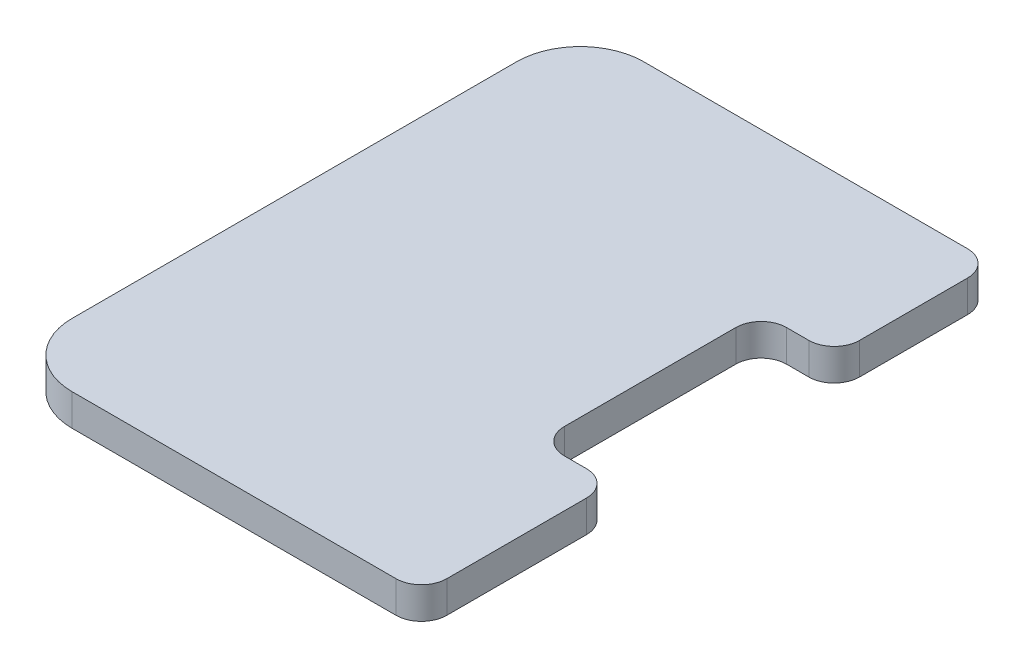
ISO-10303-21;
HEADER;
FILE_DESCRIPTION(('STEP AP214'),'2;1');
FILE_NAME('part.step','',(''),(''),'','','');
FILE_SCHEMA(('AUTOMOTIVE_DESIGN { 1 0 10303 214 1 1 1 1 }'));
ENDSEC;
DATA;
#1=APPLICATION_CONTEXT('core data for automotive mechanical design processes');
#2=APPLICATION_PROTOCOL_DEFINITION('international standard','automotive_design',2000,#1);
#3=PRODUCT_CONTEXT('',#1,'mechanical');
#4=PRODUCT('Part','Part','',(#3));
#5=PRODUCT_RELATED_PRODUCT_CATEGORY('part','',(#4));
#6=PRODUCT_DEFINITION_FORMATION('','',#4);
#7=PRODUCT_DEFINITION_CONTEXT('part definition',#1,'design');
#8=PRODUCT_DEFINITION('design','',#6,#7);
#9=PRODUCT_DEFINITION_SHAPE('','',#8);
#10=(LENGTH_UNIT() NAMED_UNIT(*) SI_UNIT(.MILLI.,.METRE.));
#11=(NAMED_UNIT(*) PLANE_ANGLE_UNIT() SI_UNIT($,.RADIAN.));
#12=(NAMED_UNIT(*) SI_UNIT($,.STERADIAN.) SOLID_ANGLE_UNIT());
#13=UNCERTAINTY_MEASURE_WITH_UNIT(LENGTH_MEASURE(1.E-05),#10,'distance_accuracy_value','');
#14=(GEOMETRIC_REPRESENTATION_CONTEXT(3) GLOBAL_UNCERTAINTY_ASSIGNED_CONTEXT((#13)) GLOBAL_UNIT_ASSIGNED_CONTEXT((#10,
#11,#12)) REPRESENTATION_CONTEXT('',''));
#15=CARTESIAN_POINT('',(0.,0.,0.));
#16=DIRECTION('',(0.,0.,1.));
#17=DIRECTION('',(1.,0.,0.));
#18=AXIS2_PLACEMENT_3D('',#15,#16,#17);
#19=CARTESIAN_POINT('',(20.6375,3.175,28.575));
#20=DIRECTION('',(-1.,0.,0.));
#21=DIRECTION('',(0.,0.,1.));
#22=AXIS2_PLACEMENT_3D('',#19,#20,#21);
#23=PLANE('',#22);
#24=DIRECTION('',(0.,0.,-1.));
#25=VECTOR('',#24,1.);
#26=CARTESIAN_POINT('',(20.6375,3.175,28.575));
#27=LINE('',#26,#25);
#28=CARTESIAN_POINT('',(20.6375,3.175,26.035));
#29=VERTEX_POINT('',#28);
#30=CARTESIAN_POINT('',(20.6375,3.175,12.065));
#31=VERTEX_POINT('',#30);
#32=EDGE_CURVE('E214',#29,#31,#27,.T.);
#33=ORIENTED_EDGE('',*,*,#32,.F.);
#34=DIRECTION('',(0.,-1.,0.));
#35=VECTOR('',#34,1.);
#36=CARTESIAN_POINT('',(20.6375,3.175,26.035));
#37=LINE('',#36,#35);
#38=CARTESIAN_POINT('',(20.6375,0.,26.035));
#39=VERTEX_POINT('',#38);
#40=EDGE_CURVE('E198',#29,#39,#37,.T.);
#41=ORIENTED_EDGE('',*,*,#40,.T.);
#42=DIRECTION('',(0.,0.,-1.));
#43=VECTOR('',#42,1.);
#44=CARTESIAN_POINT('',(20.6375,0.,28.575));
#45=LINE('',#44,#43);
#46=CARTESIAN_POINT('',(20.6375,0.,12.065));
#47=VERTEX_POINT('',#46);
#48=EDGE_CURVE('E211',#39,#47,#45,.T.);
#49=ORIENTED_EDGE('',*,*,#48,.T.);
#50=DIRECTION('',(0.,1.,0.));
#51=VECTOR('',#50,1.);
#52=CARTESIAN_POINT('',(20.6375,3.175,12.065));
#53=LINE('',#52,#51);
#54=EDGE_CURVE('E217',#47,#31,#53,.T.);
#55=ORIENTED_EDGE('',*,*,#54,.T.);
#56=EDGE_LOOP('',(#33,#41,#49,#55));
#57=FACE_BOUND('',#56,.T.);
#58=ADVANCED_FACE('F45',(#57),#23,.F.);
#59=CARTESIAN_POINT('',(20.6375,0.,-15.24));
#60=VERTEX_POINT('',#59);
#61=CARTESIAN_POINT('',(20.6375,0.,-26.035));
#62=VERTEX_POINT('',#61);
#63=EDGE_CURVE('E225',#60,#62,#45,.T.);
#64=ORIENTED_EDGE('',*,*,#63,.T.);
#65=DIRECTION('',(0.,-1.,0.));
#66=VECTOR('',#65,1.);
#67=CARTESIAN_POINT('',(20.6375,3.175,-26.035));
#68=LINE('',#67,#66);
#69=CARTESIAN_POINT('',(20.6375,3.175,-26.035));
#70=VERTEX_POINT('',#69);
#71=EDGE_CURVE('E273',#62,#70,#68,.F.);
#72=ORIENTED_EDGE('',*,*,#71,.T.);
#73=CARTESIAN_POINT('',(20.6375,3.175,-15.24));
#74=VERTEX_POINT('',#73);
#75=EDGE_CURVE('E243',#74,#70,#27,.T.);
#76=ORIENTED_EDGE('',*,*,#75,.F.);
#77=DIRECTION('',(0.,1.,0.));
#78=VECTOR('',#77,1.);
#79=CARTESIAN_POINT('',(20.6375,3.175,-15.24));
#80=LINE('',#79,#78);
#81=EDGE_CURVE('E270',#74,#60,#80,.F.);
#82=ORIENTED_EDGE('',*,*,#81,.T.);
#83=EDGE_LOOP('',(#64,#72,#76,#82));
#84=FACE_BOUND('',#83,.T.);
#85=ADVANCED_FACE('F355',(#84),#23,.F.);
#86=CARTESIAN_POINT('',(-20.6375,3.175,-28.575));
#87=DIRECTION('',(0.,0.,1.));
#88=DIRECTION('',(1.,0.,0.));
#89=AXIS2_PLACEMENT_3D('',#86,#87,#88);
#90=PLANE('',#89);
#91=DIRECTION('',(-1.,0.,0.));
#92=VECTOR('',#91,1.);
#93=CARTESIAN_POINT('',(-20.6375,0.,-28.575));
#94=LINE('',#93,#92);
#95=CARTESIAN_POINT('',(18.0975,0.,-28.575));
#96=VERTEX_POINT('',#95);
#97=CARTESIAN_POINT('',(-14.2875,0.,-28.575));
#98=VERTEX_POINT('',#97);
#99=EDGE_CURVE('E224',#96,#98,#94,.T.);
#100=ORIENTED_EDGE('',*,*,#99,.T.);
#101=DIRECTION('',(0.,-1.,0.));
#102=VECTOR('',#101,1.);
#103=CARTESIAN_POINT('',(-14.2875,3.175,-28.575));
#104=LINE('',#103,#102);
#105=CARTESIAN_POINT('',(-14.2875,3.175,-28.575));
#106=VERTEX_POINT('',#105);
#107=EDGE_CURVE('E11',#98,#106,#104,.F.);
#108=ORIENTED_EDGE('',*,*,#107,.T.);
#109=DIRECTION('',(-1.,0.,0.));
#110=VECTOR('',#109,1.);
#111=CARTESIAN_POINT('',(-20.6375,3.175,-28.575));
#112=LINE('',#111,#110);
#113=CARTESIAN_POINT('',(18.0975,3.175,-28.575));
#114=VERTEX_POINT('',#113);
#115=EDGE_CURVE('E347',#114,#106,#112,.T.);
#116=ORIENTED_EDGE('',*,*,#115,.F.);
#117=DIRECTION('',(0.,-1.,0.));
#118=VECTOR('',#117,1.);
#119=CARTESIAN_POINT('',(18.0975,3.175,-28.575));
#120=LINE('',#119,#118);
#121=EDGE_CURVE('E266',#114,#96,#120,.T.);
#122=ORIENTED_EDGE('',*,*,#121,.T.);
#123=EDGE_LOOP('',(#100,#108,#116,#122));
#124=FACE_BOUND('',#123,.T.);
#125=ADVANCED_FACE('F345',(#124),#90,.F.);
#126=CARTESIAN_POINT('',(-20.6375,3.175,28.575));
#127=DIRECTION('',(1.,0.,0.));
#128=DIRECTION('',(0.,0.,-1.));
#129=AXIS2_PLACEMENT_3D('',#126,#127,#128);
#130=PLANE('',#129);
#131=DIRECTION('',(0.,0.,1.));
#132=VECTOR('',#131,1.);
#133=CARTESIAN_POINT('',(-20.6375,0.,28.575));
#134=LINE('',#133,#132);
#135=CARTESIAN_POINT('',(-20.6375,0.,-22.225));
#136=VERTEX_POINT('',#135);
#137=CARTESIAN_POINT('',(-20.6375,0.,22.225));
#138=VERTEX_POINT('',#137);
#139=EDGE_CURVE('E229',#136,#138,#134,.T.);
#140=ORIENTED_EDGE('',*,*,#139,.T.);
#141=DIRECTION('',(0.,-1.,0.));
#142=VECTOR('',#141,1.);
#143=CARTESIAN_POINT('',(-20.6375,3.175,22.225));
#144=LINE('',#143,#142);
#145=CARTESIAN_POINT('',(-20.6375,3.175,22.225));
#146=VERTEX_POINT('',#145);
#147=EDGE_CURVE('E72',#138,#146,#144,.F.);
#148=ORIENTED_EDGE('',*,*,#147,.T.);
#149=DIRECTION('',(0.,0.,1.));
#150=VECTOR('',#149,1.);
#151=CARTESIAN_POINT('',(-20.6375,3.175,28.575));
#152=LINE('',#151,#150);
#153=CARTESIAN_POINT('',(-20.6375,3.175,-22.225));
#154=VERTEX_POINT('',#153);
#155=EDGE_CURVE('E333',#154,#146,#152,.T.);
#156=ORIENTED_EDGE('',*,*,#155,.F.);
#157=DIRECTION('',(0.,-1.,0.));
#158=VECTOR('',#157,1.);
#159=CARTESIAN_POINT('',(-20.6375,3.175,-22.225));
#160=LINE('',#159,#158);
#161=EDGE_CURVE('E319',#154,#136,#160,.T.);
#162=ORIENTED_EDGE('',*,*,#161,.T.);
#163=EDGE_LOOP('',(#140,#148,#156,#162));
#164=FACE_BOUND('',#163,.T.);
#165=ADVANCED_FACE('F340',(#164),#130,.F.);
#166=CARTESIAN_POINT('',(-20.6375,3.175,28.575));
#167=DIRECTION('',(0.,0.,-1.));
#168=DIRECTION('',(-1.,0.,0.));
#169=AXIS2_PLACEMENT_3D('',#166,#167,#168);
#170=PLANE('',#169);
#171=DIRECTION('',(1.,0.,0.));
#172=VECTOR('',#171,1.);
#173=CARTESIAN_POINT('',(-20.6375,3.175,28.575));
#174=LINE('',#173,#172);
#175=CARTESIAN_POINT('',(-14.2875,3.175,28.575));
#176=VERTEX_POINT('',#175);
#177=CARTESIAN_POINT('',(18.0975,3.175,28.575));
#178=VERTEX_POINT('',#177);
#179=EDGE_CURVE('E235',#176,#178,#174,.T.);
#180=ORIENTED_EDGE('',*,*,#179,.F.);
#181=DIRECTION('',(0.,-1.,0.));
#182=VECTOR('',#181,1.);
#183=CARTESIAN_POINT('',(-14.2875,3.175,28.575));
#184=LINE('',#183,#182);
#185=CARTESIAN_POINT('',(-14.2875,0.,28.575));
#186=VERTEX_POINT('',#185);
#187=EDGE_CURVE('E309',#176,#186,#184,.T.);
#188=ORIENTED_EDGE('',*,*,#187,.T.);
#189=DIRECTION('',(1.,0.,0.));
#190=VECTOR('',#189,1.);
#191=CARTESIAN_POINT('',(-20.6375,0.,28.575));
#192=LINE('',#191,#190);
#193=CARTESIAN_POINT('',(18.0975,0.,28.575));
#194=VERTEX_POINT('',#193);
#195=EDGE_CURVE('E240',#186,#194,#192,.T.);
#196=ORIENTED_EDGE('',*,*,#195,.T.);
#197=DIRECTION('',(0.,-1.,0.));
#198=VECTOR('',#197,1.);
#199=CARTESIAN_POINT('',(18.0975,3.175,28.575));
#200=LINE('',#199,#198);
#201=EDGE_CURVE('E200',#194,#178,#200,.F.);
#202=ORIENTED_EDGE('',*,*,#201,.T.);
#203=EDGE_LOOP('',(#180,#188,#196,#202));
#204=FACE_BOUND('',#203,.T.);
#205=ADVANCED_FACE('F337',(#204),#170,.F.);
#206=CARTESIAN_POINT('',(0.,3.175,0.));
#207=DIRECTION('',(0.,-1.,0.));
#208=DIRECTION('',(0.,0.,-1.));
#209=AXIS2_PLACEMENT_3D('',#206,#207,#208);
#210=PLANE('',#209);
#211=ORIENTED_EDGE('',*,*,#155,.T.);
#212=CARTESIAN_POINT('',(-14.2875,3.175,22.225));
#213=DIRECTION('',(0.,-1.,0.));
#214=DIRECTION('',(0.,0.,-1.));
#215=AXIS2_PLACEMENT_3D('',#212,#213,#214);
#216=CIRCLE('',#215,6.35);
#217=EDGE_CURVE('E54',#146,#176,#216,.F.);
#218=ORIENTED_EDGE('',*,*,#217,.T.);
#219=ORIENTED_EDGE('',*,*,#179,.T.);
#220=CARTESIAN_POINT('',(18.0975,3.175,26.035));
#221=DIRECTION('',(0.,-1.,0.));
#222=DIRECTION('',(0.,0.,-1.));
#223=AXIS2_PLACEMENT_3D('',#220,#221,#222);
#224=CIRCLE('',#223,2.54);
#225=EDGE_CURVE('E263',#178,#29,#224,.F.);
#226=ORIENTED_EDGE('',*,*,#225,.T.);
#227=ORIENTED_EDGE('',*,*,#32,.T.);
#228=CARTESIAN_POINT('',(18.0975,3.175,12.065));
#229=DIRECTION('',(0.,-1.,0.));
#230=DIRECTION('',(0.,0.,-1.));
#231=AXIS2_PLACEMENT_3D('',#228,#229,#230);
#232=CIRCLE('',#231,2.54);
#233=CARTESIAN_POINT('',(18.0975,3.175,9.525));
#234=VERTEX_POINT('',#233);
#235=EDGE_CURVE('E257',#31,#234,#232,.F.);
#236=ORIENTED_EDGE('',*,*,#235,.T.);
#237=DIRECTION('',(1.,0.,0.));
#238=VECTOR('',#237,1.);
#239=CARTESIAN_POINT('',(20.6375,3.175,9.525));
#240=LINE('',#239,#238);
#241=CARTESIAN_POINT('',(15.875,3.175,9.525));
#242=VERTEX_POINT('',#241);
#243=EDGE_CURVE('E373',#242,#234,#240,.T.);
#244=ORIENTED_EDGE('',*,*,#243,.F.);
#245=CARTESIAN_POINT('',(15.875,3.175,6.985));
#246=DIRECTION('',(0.,-1.,0.));
#247=DIRECTION('',(0.,0.,-1.));
#248=AXIS2_PLACEMENT_3D('',#245,#246,#247);
#249=CIRCLE('',#248,2.54);
#250=CARTESIAN_POINT('',(13.335,3.175,6.985));
#251=VERTEX_POINT('',#250);
#252=EDGE_CURVE('E297',#242,#251,#249,.T.);
#253=ORIENTED_EDGE('',*,*,#252,.T.);
#254=DIRECTION('',(0.,0.,1.));
#255=VECTOR('',#254,1.);
#256=CARTESIAN_POINT('',(13.335,3.175,9.525));
#257=LINE('',#256,#255);
#258=CARTESIAN_POINT('',(13.335,3.175,-10.16));
#259=VERTEX_POINT('',#258);
#260=EDGE_CURVE('E380',#259,#251,#257,.T.);
#261=ORIENTED_EDGE('',*,*,#260,.F.);
#262=CARTESIAN_POINT('',(15.875,3.175,-10.16));
#263=DIRECTION('',(0.,-1.,0.));
#264=DIRECTION('',(0.,0.,-1.));
#265=AXIS2_PLACEMENT_3D('',#262,#263,#264);
#266=CIRCLE('',#265,2.54);
#267=CARTESIAN_POINT('',(15.875,3.175,-12.7));
#268=VERTEX_POINT('',#267);
#269=EDGE_CURVE('E303',#259,#268,#266,.T.);
#270=ORIENTED_EDGE('',*,*,#269,.T.);
#271=DIRECTION('',(-1.,0.,0.));
#272=VECTOR('',#271,1.);
#273=CARTESIAN_POINT('',(13.335,3.175,-12.7));
#274=LINE('',#273,#272);
#275=CARTESIAN_POINT('',(18.0975,3.175,-12.7));
#276=VERTEX_POINT('',#275);
#277=EDGE_CURVE('E384',#276,#268,#274,.T.);
#278=ORIENTED_EDGE('',*,*,#277,.F.);
#279=CARTESIAN_POINT('',(18.0975,3.175,-15.24));
#280=DIRECTION('',(0.,-1.,0.));
#281=DIRECTION('',(0.,0.,-1.));
#282=AXIS2_PLACEMENT_3D('',#279,#280,#281);
#283=CIRCLE('',#282,2.54);
#284=EDGE_CURVE('E254',#276,#74,#283,.F.);
#285=ORIENTED_EDGE('',*,*,#284,.T.);
#286=ORIENTED_EDGE('',*,*,#75,.T.);
#287=CARTESIAN_POINT('',(18.0975,3.175,-26.035));
#288=DIRECTION('',(0.,-1.,0.));
#289=DIRECTION('',(0.,0.,-1.));
#290=AXIS2_PLACEMENT_3D('',#287,#288,#289);
#291=CIRCLE('',#290,2.54);
#292=EDGE_CURVE('E260',#70,#114,#291,.F.);
#293=ORIENTED_EDGE('',*,*,#292,.T.);
#294=ORIENTED_EDGE('',*,*,#115,.T.);
#295=CARTESIAN_POINT('',(-14.2875,3.175,-22.225));
#296=DIRECTION('',(0.,-1.,0.));
#297=DIRECTION('',(0.,0.,-1.));
#298=AXIS2_PLACEMENT_3D('',#295,#296,#297);
#299=CIRCLE('',#298,6.35);
#300=EDGE_CURVE('E325',#106,#154,#299,.F.);
#301=ORIENTED_EDGE('',*,*,#300,.T.);
#302=EDGE_LOOP('',(#211,#218,#219,#226,#227,#236,#244,#253,#261,#270,#278,#285,#286,#293,#294,#301));
#303=FACE_BOUND('',#302,.T.);
#304=ADVANCED_FACE('F332',(#303),#210,.F.);
#305=CARTESIAN_POINT('',(0.,0.,0.));
#306=DIRECTION('',(0.,-1.,0.));
#307=DIRECTION('',(0.,0.,-1.));
#308=AXIS2_PLACEMENT_3D('',#305,#306,#307);
#309=PLANE('',#308);
#310=ORIENTED_EDGE('',*,*,#195,.F.);
#311=CARTESIAN_POINT('',(-14.2875,0.,22.225));
#312=DIRECTION('',(0.,-1.,0.));
#313=DIRECTION('',(0.,0.,-1.));
#314=AXIS2_PLACEMENT_3D('',#311,#312,#313);
#315=CIRCLE('',#314,6.35);
#316=EDGE_CURVE('E316',#186,#138,#315,.T.);
#317=ORIENTED_EDGE('',*,*,#316,.T.);
#318=ORIENTED_EDGE('',*,*,#139,.F.);
#319=CARTESIAN_POINT('',(-14.2875,0.,-22.225));
#320=DIRECTION('',(0.,-1.,0.));
#321=DIRECTION('',(0.,0.,-1.));
#322=AXIS2_PLACEMENT_3D('',#319,#320,#321);
#323=CIRCLE('',#322,6.35);
#324=EDGE_CURVE('E313',#136,#98,#323,.T.);
#325=ORIENTED_EDGE('',*,*,#324,.T.);
#326=ORIENTED_EDGE('',*,*,#99,.F.);
#327=CARTESIAN_POINT('',(18.0975,0.,-26.035));
#328=DIRECTION('',(0.,-1.,0.));
#329=DIRECTION('',(0.,0.,-1.));
#330=AXIS2_PLACEMENT_3D('',#327,#328,#329);
#331=CIRCLE('',#330,2.54);
#332=EDGE_CURVE('E205',#96,#62,#331,.T.);
#333=ORIENTED_EDGE('',*,*,#332,.T.);
#334=ORIENTED_EDGE('',*,*,#63,.F.);
#335=CARTESIAN_POINT('',(18.0975,0.,-15.24));
#336=DIRECTION('',(0.,-1.,0.));
#337=DIRECTION('',(0.,0.,-1.));
#338=AXIS2_PLACEMENT_3D('',#335,#336,#337);
#339=CIRCLE('',#338,2.54);
#340=CARTESIAN_POINT('',(18.0975,0.,-12.7));
#341=VERTEX_POINT('',#340);
#342=EDGE_CURVE('E216',#60,#341,#339,.T.);
#343=ORIENTED_EDGE('',*,*,#342,.T.);
#344=DIRECTION('',(-1.,0.,0.));
#345=VECTOR('',#344,1.);
#346=CARTESIAN_POINT('',(13.335,0.,-12.7));
#347=LINE('',#346,#345);
#348=CARTESIAN_POINT('',(15.875,0.,-12.7));
#349=VERTEX_POINT('',#348);
#350=EDGE_CURVE('E364',#341,#349,#347,.T.);
#351=ORIENTED_EDGE('',*,*,#350,.T.);
#352=CARTESIAN_POINT('',(15.875,0.,-10.16));
#353=DIRECTION('',(0.,-1.,0.));
#354=DIRECTION('',(0.,0.,-1.));
#355=AXIS2_PLACEMENT_3D('',#352,#353,#354);
#356=CIRCLE('',#355,2.54);
#357=CARTESIAN_POINT('',(13.335,0.,-10.16));
#358=VERTEX_POINT('',#357);
#359=EDGE_CURVE('E306',#349,#358,#356,.F.);
#360=ORIENTED_EDGE('',*,*,#359,.T.);
#361=DIRECTION('',(0.,0.,1.));
#362=VECTOR('',#361,1.);
#363=CARTESIAN_POINT('',(13.335,0.,9.525));
#364=LINE('',#363,#362);
#365=CARTESIAN_POINT('',(13.335,0.,6.985));
#366=VERTEX_POINT('',#365);
#367=EDGE_CURVE('E372',#358,#366,#364,.T.);
#368=ORIENTED_EDGE('',*,*,#367,.T.);
#369=CARTESIAN_POINT('',(15.875,0.,6.985));
#370=DIRECTION('',(0.,-1.,0.));
#371=DIRECTION('',(0.,0.,-1.));
#372=AXIS2_PLACEMENT_3D('',#369,#370,#371);
#373=CIRCLE('',#372,2.54);
#374=CARTESIAN_POINT('',(15.875,0.,9.525));
#375=VERTEX_POINT('',#374);
#376=EDGE_CURVE('E300',#366,#375,#373,.F.);
#377=ORIENTED_EDGE('',*,*,#376,.T.);
#378=DIRECTION('',(1.,0.,0.));
#379=VECTOR('',#378,1.);
#380=CARTESIAN_POINT('',(20.6375,0.,9.525));
#381=LINE('',#380,#379);
#382=CARTESIAN_POINT('',(18.0975,0.,9.525));
#383=VERTEX_POINT('',#382);
#384=EDGE_CURVE('E233',#375,#383,#381,.T.);
#385=ORIENTED_EDGE('',*,*,#384,.T.);
#386=CARTESIAN_POINT('',(18.0975,0.,12.065));
#387=DIRECTION('',(0.,-1.,0.));
#388=DIRECTION('',(0.,0.,-1.));
#389=AXIS2_PLACEMENT_3D('',#386,#387,#388);
#390=CIRCLE('',#389,2.54);
#391=EDGE_CURVE('E222',#383,#47,#390,.T.);
#392=ORIENTED_EDGE('',*,*,#391,.T.);
#393=ORIENTED_EDGE('',*,*,#48,.F.);
#394=CARTESIAN_POINT('',(18.0975,0.,26.035));
#395=DIRECTION('',(0.,-1.,0.));
#396=DIRECTION('',(0.,0.,-1.));
#397=AXIS2_PLACEMENT_3D('',#394,#395,#396);
#398=CIRCLE('',#397,2.54);
#399=EDGE_CURVE('E194',#39,#194,#398,.T.);
#400=ORIENTED_EDGE('',*,*,#399,.T.);
#401=EDGE_LOOP('',(#310,#317,#318,#325,#326,#333,#334,#343,#351,#360,#368,#377,#385,#392,#393,#400));
#402=FACE_BOUND('',#401,.T.);
#403=ADVANCED_FACE('F219',(#402),#309,.T.);
#404=CARTESIAN_POINT('',(20.6375,0.,9.525));
#405=DIRECTION('',(0.,0.,1.));
#406=DIRECTION('',(1.,0.,0.));
#407=AXIS2_PLACEMENT_3D('',#404,#405,#406);
#408=PLANE('',#407);
#409=ORIENTED_EDGE('',*,*,#243,.T.);
#410=DIRECTION('',(0.,1.,0.));
#411=VECTOR('',#410,1.);
#412=CARTESIAN_POINT('',(18.0975,0.,9.525));
#413=LINE('',#412,#411);
#414=EDGE_CURVE('E280',#234,#383,#413,.F.);
#415=ORIENTED_EDGE('',*,*,#414,.T.);
#416=ORIENTED_EDGE('',*,*,#384,.F.);
#417=DIRECTION('',(0.,1.,0.));
#418=VECTOR('',#417,1.);
#419=CARTESIAN_POINT('',(15.875,3.175,9.525));
#420=LINE('',#419,#418);
#421=EDGE_CURVE('E276',#375,#242,#420,.T.);
#422=ORIENTED_EDGE('',*,*,#421,.T.);
#423=EDGE_LOOP('',(#409,#415,#416,#422));
#424=FACE_BOUND('',#423,.T.);
#425=ADVANCED_FACE('F399',(#424),#408,.F.);
#426=CARTESIAN_POINT('',(13.335,0.,9.525));
#427=DIRECTION('',(-1.,0.,0.));
#428=DIRECTION('',(0.,0.,1.));
#429=AXIS2_PLACEMENT_3D('',#426,#427,#428);
#430=PLANE('',#429);
#431=ORIENTED_EDGE('',*,*,#260,.T.);
#432=DIRECTION('',(0.,1.,0.));
#433=VECTOR('',#432,1.);
#434=CARTESIAN_POINT('',(13.335,0.,6.985));
#435=LINE('',#434,#433);
#436=EDGE_CURVE('E287',#251,#366,#435,.F.);
#437=ORIENTED_EDGE('',*,*,#436,.T.);
#438=ORIENTED_EDGE('',*,*,#367,.F.);
#439=DIRECTION('',(0.,1.,0.));
#440=VECTOR('',#439,1.);
#441=CARTESIAN_POINT('',(13.335,3.175,-10.16));
#442=LINE('',#441,#440);
#443=EDGE_CURVE('E283',#358,#259,#442,.T.);
#444=ORIENTED_EDGE('',*,*,#443,.T.);
#445=EDGE_LOOP('',(#431,#437,#438,#444));
#446=FACE_BOUND('',#445,.T.);
#447=ADVANCED_FACE('F425',(#446),#430,.F.);
#448=CARTESIAN_POINT('',(13.335,0.,-12.7));
#449=DIRECTION('',(0.,0.,-1.));
#450=DIRECTION('',(-1.,0.,0.));
#451=AXIS2_PLACEMENT_3D('',#448,#449,#450);
#452=PLANE('',#451);
#453=ORIENTED_EDGE('',*,*,#350,.F.);
#454=DIRECTION('',(0.,1.,0.));
#455=VECTOR('',#454,1.);
#456=CARTESIAN_POINT('',(18.0975,0.,-12.7));
#457=LINE('',#456,#455);
#458=EDGE_CURVE('E293',#341,#276,#457,.T.);
#459=ORIENTED_EDGE('',*,*,#458,.T.);
#460=ORIENTED_EDGE('',*,*,#277,.T.);
#461=DIRECTION('',(0.,1.,0.));
#462=VECTOR('',#461,1.);
#463=CARTESIAN_POINT('',(15.875,0.,-12.7));
#464=LINE('',#463,#462);
#465=EDGE_CURVE('E290',#268,#349,#464,.F.);
#466=ORIENTED_EDGE('',*,*,#465,.T.);
#467=EDGE_LOOP('',(#453,#459,#460,#466));
#468=FACE_BOUND('',#467,.T.);
#469=ADVANCED_FACE('F367',(#468),#452,.F.);
#470=CARTESIAN_POINT('',(18.0975,3.175,26.035));
#471=DIRECTION('',(0.,-1.,0.));
#472=DIRECTION('',(0.,0.,-1.));
#473=AXIS2_PLACEMENT_3D('',#470,#471,#472);
#474=CYLINDRICAL_SURFACE('',#473,2.54);
#475=ORIENTED_EDGE('',*,*,#225,.F.);
#476=ORIENTED_EDGE('',*,*,#201,.F.);
#477=ORIENTED_EDGE('',*,*,#399,.F.);
#478=ORIENTED_EDGE('',*,*,#40,.F.);
#479=EDGE_LOOP('',(#475,#476,#477,#478));
#480=FACE_BOUND('',#479,.T.);
#481=ADVANCED_FACE('F197',(#480),#474,.T.);
#482=CARTESIAN_POINT('',(18.0975,3.175,-26.035));
#483=DIRECTION('',(0.,-1.,0.));
#484=DIRECTION('',(0.,0.,-1.));
#485=AXIS2_PLACEMENT_3D('',#482,#483,#484);
#486=CYLINDRICAL_SURFACE('',#485,2.54);
#487=ORIENTED_EDGE('',*,*,#292,.F.);
#488=ORIENTED_EDGE('',*,*,#71,.F.);
#489=ORIENTED_EDGE('',*,*,#332,.F.);
#490=ORIENTED_EDGE('',*,*,#121,.F.);
#491=EDGE_LOOP('',(#487,#488,#489,#490));
#492=FACE_BOUND('',#491,.T.);
#493=ADVANCED_FACE('F350',(#492),#486,.T.);
#494=CARTESIAN_POINT('',(18.0975,3.175,12.065));
#495=DIRECTION('',(0.,1.,0.));
#496=DIRECTION('',(0.,0.,1.));
#497=AXIS2_PLACEMENT_3D('',#494,#495,#496);
#498=CYLINDRICAL_SURFACE('',#497,2.54);
#499=ORIENTED_EDGE('',*,*,#391,.F.);
#500=ORIENTED_EDGE('',*,*,#414,.F.);
#501=ORIENTED_EDGE('',*,*,#235,.F.);
#502=ORIENTED_EDGE('',*,*,#54,.F.);
#503=EDGE_LOOP('',(#499,#500,#501,#502));
#504=FACE_BOUND('',#503,.T.);
#505=ADVANCED_FACE('F402',(#504),#498,.T.);
#506=CARTESIAN_POINT('',(15.875,0.,6.985));
#507=DIRECTION('',(0.,-1.,0.));
#508=DIRECTION('',(0.,0.,-1.));
#509=AXIS2_PLACEMENT_3D('',#506,#507,#508);
#510=CYLINDRICAL_SURFACE('',#509,2.54);
#511=ORIENTED_EDGE('',*,*,#376,.F.);
#512=ORIENTED_EDGE('',*,*,#436,.F.);
#513=ORIENTED_EDGE('',*,*,#252,.F.);
#514=ORIENTED_EDGE('',*,*,#421,.F.);
#515=EDGE_LOOP('',(#511,#512,#513,#514));
#516=FACE_BOUND('',#515,.T.);
#517=ADVANCED_FACE('F404',(#516),#510,.F.);
#518=CARTESIAN_POINT('',(18.0975,0.,-15.24));
#519=DIRECTION('',(0.,1.,0.));
#520=DIRECTION('',(0.,0.,1.));
#521=AXIS2_PLACEMENT_3D('',#518,#519,#520);
#522=CYLINDRICAL_SURFACE('',#521,2.54);
#523=ORIENTED_EDGE('',*,*,#342,.F.);
#524=ORIENTED_EDGE('',*,*,#81,.F.);
#525=ORIENTED_EDGE('',*,*,#284,.F.);
#526=ORIENTED_EDGE('',*,*,#458,.F.);
#527=EDGE_LOOP('',(#523,#524,#525,#526));
#528=FACE_BOUND('',#527,.T.);
#529=ADVANCED_FACE('F360',(#528),#522,.T.);
#530=CARTESIAN_POINT('',(15.875,0.,-10.16));
#531=DIRECTION('',(0.,-1.,0.));
#532=DIRECTION('',(0.,0.,-1.));
#533=AXIS2_PLACEMENT_3D('',#530,#531,#532);
#534=CYLINDRICAL_SURFACE('',#533,2.54);
#535=ORIENTED_EDGE('',*,*,#359,.F.);
#536=ORIENTED_EDGE('',*,*,#465,.F.);
#537=ORIENTED_EDGE('',*,*,#269,.F.);
#538=ORIENTED_EDGE('',*,*,#443,.F.);
#539=EDGE_LOOP('',(#535,#536,#537,#538));
#540=FACE_BOUND('',#539,.T.);
#541=ADVANCED_FACE('F453',(#540),#534,.F.);
#542=CARTESIAN_POINT('',(-14.2875,3.175,22.225));
#543=DIRECTION('',(0.,-1.,0.));
#544=DIRECTION('',(0.,0.,-1.));
#545=AXIS2_PLACEMENT_3D('',#542,#543,#544);
#546=CYLINDRICAL_SURFACE('',#545,6.35);
#547=ORIENTED_EDGE('',*,*,#217,.F.);
#548=ORIENTED_EDGE('',*,*,#147,.F.);
#549=ORIENTED_EDGE('',*,*,#316,.F.);
#550=ORIENTED_EDGE('',*,*,#187,.F.);
#551=EDGE_LOOP('',(#547,#548,#549,#550));
#552=FACE_BOUND('',#551,.T.);
#553=ADVANCED_FACE('F338',(#552),#546,.T.);
#554=CARTESIAN_POINT('',(-14.2875,3.175,-22.225));
#555=DIRECTION('',(0.,-1.,0.));
#556=DIRECTION('',(0.,0.,-1.));
#557=AXIS2_PLACEMENT_3D('',#554,#555,#556);
#558=CYLINDRICAL_SURFACE('',#557,6.35);
#559=ORIENTED_EDGE('',*,*,#300,.F.);
#560=ORIENTED_EDGE('',*,*,#107,.F.);
#561=ORIENTED_EDGE('',*,*,#324,.F.);
#562=ORIENTED_EDGE('',*,*,#161,.F.);
#563=EDGE_LOOP('',(#559,#560,#561,#562));
#564=FACE_BOUND('',#563,.T.);
#565=ADVANCED_FACE('F47',(#564),#558,.T.);
#566=CLOSED_SHELL('',(#58,#85,#125,#165,#205,#304,#403,#425,#447,#469,#481,#493,#505,#517,#529,
#541,#553,#565));
#567=MANIFOLD_SOLID_BREP('B2',#566);
#568=ADVANCED_BREP_SHAPE_REPRESENTATION('',(#18,#567),#14);
#569=SHAPE_DEFINITION_REPRESENTATION(#9,#568);
ENDSEC;
END-ISO-10303-21;
